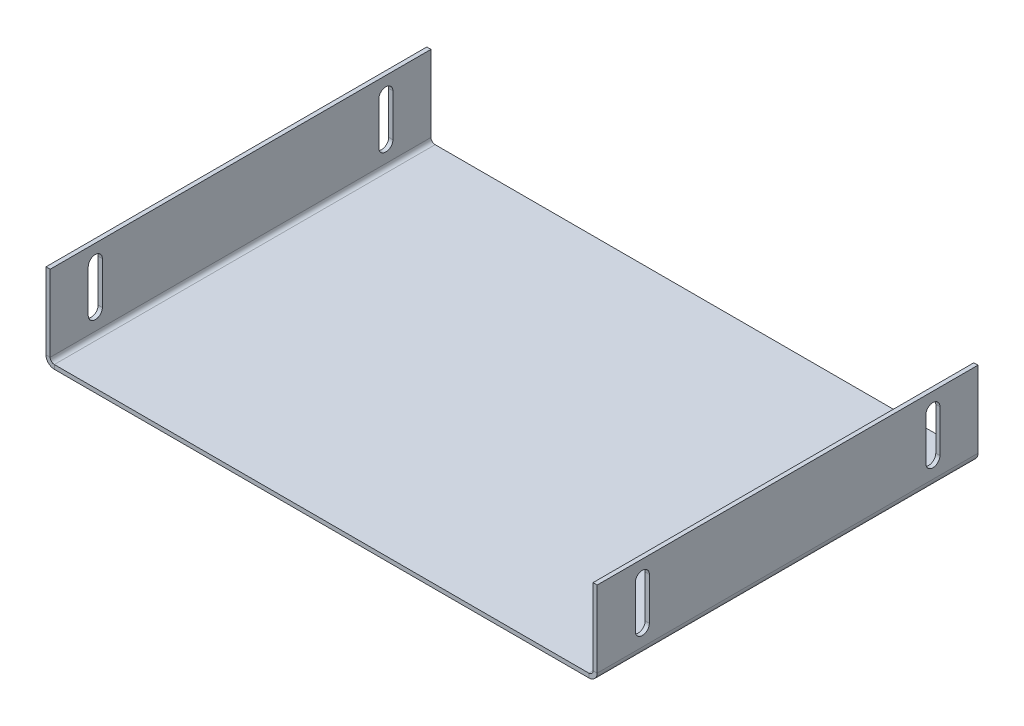
ISO-10303-21;
HEADER;
FILE_DESCRIPTION(('STEP AP214'),'2;1');
FILE_NAME('part.step','',(''),(''),'','','');
FILE_SCHEMA(('AUTOMOTIVE_DESIGN { 1 0 10303 214 1 1 1 1 }'));
ENDSEC;
DATA;
#1=APPLICATION_CONTEXT('core data for automotive mechanical design processes');
#2=APPLICATION_PROTOCOL_DEFINITION('international standard','automotive_design',2000,#1);
#3=PRODUCT_CONTEXT('',#1,'mechanical');
#4=PRODUCT('Part','Part','',(#3));
#5=PRODUCT_RELATED_PRODUCT_CATEGORY('part','',(#4));
#6=PRODUCT_DEFINITION_FORMATION('','',#4);
#7=PRODUCT_DEFINITION_CONTEXT('part definition',#1,'design');
#8=PRODUCT_DEFINITION('design','',#6,#7);
#9=PRODUCT_DEFINITION_SHAPE('','',#8);
#10=(LENGTH_UNIT() NAMED_UNIT(*) SI_UNIT(.MILLI.,.METRE.));
#11=(NAMED_UNIT(*) PLANE_ANGLE_UNIT() SI_UNIT($,.RADIAN.));
#12=(NAMED_UNIT(*) SI_UNIT($,.STERADIAN.) SOLID_ANGLE_UNIT());
#13=UNCERTAINTY_MEASURE_WITH_UNIT(LENGTH_MEASURE(1.E-05),#10,'distance_accuracy_value','');
#14=(GEOMETRIC_REPRESENTATION_CONTEXT(3) GLOBAL_UNCERTAINTY_ASSIGNED_CONTEXT((#13)) GLOBAL_UNIT_ASSIGNED_CONTEXT((#10,
#11,#12)) REPRESENTATION_CONTEXT('',''));
#15=CARTESIAN_POINT('',(0.,0.,0.));
#16=DIRECTION('',(0.,0.,1.));
#17=DIRECTION('',(1.,0.,0.));
#18=AXIS2_PLACEMENT_3D('',#15,#16,#17);
#19=CARTESIAN_POINT('',(-47.1104,-0.7366,34.7960604210801));
#20=DIRECTION('',(0.,0.,1.));
#21=DIRECTION('',(1.,0.,0.));
#22=AXIS2_PLACEMENT_3D('',#19,#20,#21);
#23=PLANE('',#22);
#24=DIRECTION('',(1.,0.,0.));
#25=VECTOR('',#24,1.);
#26=CARTESIAN_POINT('',(-47.1104,0.,34.7960604210801));
#27=LINE('',#26,#25);
#28=CARTESIAN_POINT('',(-47.3738,0.,34.7960604210801));
#29=VERTEX_POINT('',#28);
#30=CARTESIAN_POINT('',(47.3738,0.,34.7960604210801));
#31=VERTEX_POINT('',#30);
#32=EDGE_CURVE('E468',#29,#31,#27,.T.);
#33=ORIENTED_EDGE('',*,*,#32,.F.);
#34=DIRECTION('',(0.,-1.,0.));
#35=VECTOR('',#34,1.);
#36=CARTESIAN_POINT('',(-47.3738,0.,34.7960604210801));
#37=LINE('',#36,#35);
#38=CARTESIAN_POINT('',(-47.3738,-0.736600000000006,34.7960604210801));
#39=VERTEX_POINT('',#38);
#40=EDGE_CURVE('E395',#29,#39,#37,.T.);
#41=ORIENTED_EDGE('',*,*,#40,.T.);
#42=DIRECTION('',(1.,0.,0.));
#43=VECTOR('',#42,1.);
#44=CARTESIAN_POINT('',(-47.1104,-0.7366,34.7960604210801));
#45=LINE('',#44,#43);
#46=CARTESIAN_POINT('',(47.3738,-0.736599999999999,34.7960604210801));
#47=VERTEX_POINT('',#46);
#48=EDGE_CURVE('E467',#39,#47,#45,.T.);
#49=ORIENTED_EDGE('',*,*,#48,.T.);
#50=DIRECTION('',(0.,-1.,0.));
#51=VECTOR('',#50,1.);
#52=CARTESIAN_POINT('',(47.3738,0.,34.7960604210801));
#53=LINE('',#52,#51);
#54=EDGE_CURVE('E458',#31,#47,#53,.T.);
#55=ORIENTED_EDGE('',*,*,#54,.F.);
#56=EDGE_LOOP('',(#33,#41,#49,#55));
#57=FACE_BOUND('',#56,.T.);
#58=ADVANCED_FACE('F75',(#57),#23,.T.);
#59=CARTESIAN_POINT('',(-47.1104,-0.7366,-32.7039395789199));
#60=DIRECTION('',(0.,0.,-1.));
#61=DIRECTION('',(-1.,0.,0.));
#62=AXIS2_PLACEMENT_3D('',#59,#60,#61);
#63=PLANE('',#62);
#64=DIRECTION('',(-1.,0.,0.));
#65=VECTOR('',#64,1.);
#66=CARTESIAN_POINT('',(-47.1104,0.,-32.7039395789199));
#67=LINE('',#66,#65);
#68=CARTESIAN_POINT('',(47.3738,0.,-32.7039395789199));
#69=VERTEX_POINT('',#68);
#70=CARTESIAN_POINT('',(-47.3738,0.,-32.7039395789199));
#71=VERTEX_POINT('',#70);
#72=EDGE_CURVE('E461',#69,#71,#67,.T.);
#73=ORIENTED_EDGE('',*,*,#72,.F.);
#74=DIRECTION('',(0.,-1.,0.));
#75=VECTOR('',#74,1.);
#76=CARTESIAN_POINT('',(47.3738,0.,-32.7039395789199));
#77=LINE('',#76,#75);
#78=CARTESIAN_POINT('',(47.3738,-0.736599999999989,-32.7039395789199));
#79=VERTEX_POINT('',#78);
#80=EDGE_CURVE('E448',#69,#79,#77,.T.);
#81=ORIENTED_EDGE('',*,*,#80,.T.);
#82=DIRECTION('',(-1.,0.,0.));
#83=VECTOR('',#82,1.);
#84=CARTESIAN_POINT('',(-47.1104,-0.7366,-32.7039395789199));
#85=LINE('',#84,#83);
#86=CARTESIAN_POINT('',(-47.3738,-0.736599999999996,-32.7039395789199));
#87=VERTEX_POINT('',#86);
#88=EDGE_CURVE('E464',#79,#87,#85,.T.);
#89=ORIENTED_EDGE('',*,*,#88,.T.);
#90=DIRECTION('',(0.,-1.,0.));
#91=VECTOR('',#90,1.);
#92=CARTESIAN_POINT('',(-47.3738,0.,-32.7039395789199));
#93=LINE('',#92,#91);
#94=EDGE_CURVE('E405',#71,#87,#93,.T.);
#95=ORIENTED_EDGE('',*,*,#94,.F.);
#96=EDGE_LOOP('',(#73,#81,#89,#95));
#97=FACE_BOUND('',#96,.T.);
#98=ADVANCED_FACE('F77',(#97),#63,.T.);
#99=CARTESIAN_POINT('',(0.,-0.7366,0.));
#100=DIRECTION('',(0.,-1.,0.));
#101=DIRECTION('',(0.,0.,-1.));
#102=AXIS2_PLACEMENT_3D('',#99,#100,#101);
#103=PLANE('',#102);
#104=ORIENTED_EDGE('',*,*,#88,.F.);
#105=DIRECTION('',(0.,0.,-1.));
#106=VECTOR('',#105,1.);
#107=CARTESIAN_POINT('',(47.3738,-0.736599999999989,-32.7039395789199));
#108=LINE('',#107,#106);
#109=EDGE_CURVE('E441',#79,#47,#108,.F.);
#110=ORIENTED_EDGE('',*,*,#109,.T.);
#111=ORIENTED_EDGE('',*,*,#48,.F.);
#112=DIRECTION('',(0.,0.,1.));
#113=VECTOR('',#112,1.);
#114=CARTESIAN_POINT('',(-47.3738,-0.736600000000006,34.7960604210801));
#115=LINE('',#114,#113);
#116=EDGE_CURVE('E388',#39,#87,#115,.F.);
#117=ORIENTED_EDGE('',*,*,#116,.T.);
#118=EDGE_LOOP('',(#104,#110,#111,#117));
#119=FACE_BOUND('',#118,.T.);
#120=ADVANCED_FACE('F558',(#119),#103,.T.);
#121=CARTESIAN_POINT('',(0.,0.,0.));
#122=DIRECTION('',(0.,-1.,0.));
#123=DIRECTION('',(0.,0.,-1.));
#124=AXIS2_PLACEMENT_3D('',#121,#122,#123);
#125=PLANE('',#124);
#126=ORIENTED_EDGE('',*,*,#32,.T.);
#127=DIRECTION('',(0.,0.,-1.));
#128=VECTOR('',#127,1.);
#129=CARTESIAN_POINT('',(47.3738,0.,-32.7039395789199));
#130=LINE('',#129,#128);
#131=EDGE_CURVE('E454',#69,#31,#130,.F.);
#132=ORIENTED_EDGE('',*,*,#131,.F.);
#133=ORIENTED_EDGE('',*,*,#72,.T.);
#134=DIRECTION('',(0.,0.,1.));
#135=VECTOR('',#134,1.);
#136=CARTESIAN_POINT('',(-47.3738,0.,34.7960604210801));
#137=LINE('',#136,#135);
#138=EDGE_CURVE('E401',#29,#71,#137,.F.);
#139=ORIENTED_EDGE('',*,*,#138,.F.);
#140=EDGE_LOOP('',(#126,#132,#133,#139));
#141=FACE_BOUND('',#140,.T.);
#142=ADVANCED_FACE('F562',(#141),#125,.F.);
#143=CARTESIAN_POINT('',(47.3738,0.736599999999998,34.7960604210801));
#144=DIRECTION('',(0.,0.,1.));
#145=DIRECTION('',(0.,-1.,0.));
#146=AXIS2_PLACEMENT_3D('',#143,#144,#145);
#147=PLANE('',#146);
#148=DIRECTION('',(-1.,0.,0.));
#149=VECTOR('',#148,1.);
#150=CARTESIAN_POINT('',(48.847,0.736599999999994,34.7960604210801));
#151=LINE('',#150,#149);
#152=CARTESIAN_POINT('',(48.1104,0.736599999999995,34.7960604210801));
#153=VERTEX_POINT('',#152);
#154=CARTESIAN_POINT('',(48.847,0.736599999999993,34.7960604210801));
#155=VERTEX_POINT('',#154);
#156=EDGE_CURVE('E408',#153,#155,#151,.F.);
#157=ORIENTED_EDGE('',*,*,#156,.F.);
#158=CARTESIAN_POINT('',(47.3738,0.736599999999998,34.7960604210801));
#159=DIRECTION('',(0.,0.,-1.));
#160=DIRECTION('',(0.,1.,0.));
#161=AXIS2_PLACEMENT_3D('',#158,#159,#160);
#162=CIRCLE('',#161,0.736599999999997);
#163=EDGE_CURVE('E451',#31,#153,#162,.F.);
#164=ORIENTED_EDGE('',*,*,#163,.F.);
#165=ORIENTED_EDGE('',*,*,#54,.T.);
#166=CARTESIAN_POINT('',(47.3738,0.736599999999998,34.7960604210801));
#167=DIRECTION('',(0.,0.,-1.));
#168=DIRECTION('',(0.,1.,0.));
#169=AXIS2_PLACEMENT_3D('',#166,#167,#168);
#170=CIRCLE('',#169,1.4732);
#171=EDGE_CURVE('E444',#47,#155,#170,.F.);
#172=ORIENTED_EDGE('',*,*,#171,.T.);
#173=EDGE_LOOP('',(#157,#164,#165,#172));
#174=FACE_BOUND('',#173,.T.);
#175=ADVANCED_FACE('F565',(#174),#147,.T.);
#176=CARTESIAN_POINT('',(47.3738,0.736600000000008,-32.7039395789199));
#177=DIRECTION('',(0.,0.,1.));
#178=DIRECTION('',(0.,-1.,0.));
#179=AXIS2_PLACEMENT_3D('',#176,#177,#178);
#180=PLANE('',#179);
#181=CARTESIAN_POINT('',(47.3738,0.736600000000008,-32.7039395789199));
#182=DIRECTION('',(0.,0.,-1.));
#183=DIRECTION('',(0.,1.,0.));
#184=AXIS2_PLACEMENT_3D('',#181,#182,#183);
#185=CIRCLE('',#184,0.736599999999997);
#186=CARTESIAN_POINT('',(48.1104,0.736600000000005,-32.7039395789199));
#187=VERTEX_POINT('',#186);
#188=EDGE_CURVE('E414',#187,#69,#185,.T.);
#189=ORIENTED_EDGE('',*,*,#188,.F.);
#190=DIRECTION('',(-1.,0.,0.));
#191=VECTOR('',#190,1.);
#192=CARTESIAN_POINT('',(48.1104,0.736600000000004,-32.7039395789199));
#193=LINE('',#192,#191);
#194=CARTESIAN_POINT('',(48.847,0.736600000000001,-32.7039395789199));
#195=VERTEX_POINT('',#194);
#196=EDGE_CURVE('E434',#187,#195,#193,.F.);
#197=ORIENTED_EDGE('',*,*,#196,.T.);
#198=CARTESIAN_POINT('',(47.3738,0.736600000000008,-32.7039395789199));
#199=DIRECTION('',(0.,0.,-1.));
#200=DIRECTION('',(0.,1.,0.));
#201=AXIS2_PLACEMENT_3D('',#198,#199,#200);
#202=CIRCLE('',#201,1.4732);
#203=EDGE_CURVE('E445',#195,#79,#202,.T.);
#204=ORIENTED_EDGE('',*,*,#203,.T.);
#205=ORIENTED_EDGE('',*,*,#80,.F.);
#206=EDGE_LOOP('',(#189,#197,#204,#205));
#207=FACE_BOUND('',#206,.T.);
#208=ADVANCED_FACE('F570',(#207),#180,.F.);
#209=CARTESIAN_POINT('',(47.3738,0.736600000000008,-32.7039395789199));
#210=DIRECTION('',(0.,0.,-1.));
#211=DIRECTION('',(1.,0.,0.));
#212=AXIS2_PLACEMENT_3D('',#209,#210,#211);
#213=CYLINDRICAL_SURFACE('',#212,1.4732);
#214=ORIENTED_EDGE('',*,*,#109,.F.);
#215=ORIENTED_EDGE('',*,*,#203,.F.);
#216=DIRECTION('',(0.,0.,-1.));
#217=VECTOR('',#216,1.);
#218=CARTESIAN_POINT('',(48.847,0.736599999999994,34.79606042108));
#219=LINE('',#218,#217);
#220=EDGE_CURVE('E432',#195,#155,#219,.F.);
#221=ORIENTED_EDGE('',*,*,#220,.T.);
#222=ORIENTED_EDGE('',*,*,#171,.F.);
#223=EDGE_LOOP('',(#214,#215,#221,#222));
#224=FACE_BOUND('',#223,.T.);
#225=ADVANCED_FACE('F573',(#224),#213,.T.);
#226=CARTESIAN_POINT('',(47.3738,0.736600000000008,-32.7039395789199));
#227=DIRECTION('',(0.,0.,-1.));
#228=DIRECTION('',(1.,0.,0.));
#229=AXIS2_PLACEMENT_3D('',#226,#227,#228);
#230=CYLINDRICAL_SURFACE('',#229,0.736599999999997);
#231=ORIENTED_EDGE('',*,*,#131,.T.);
#232=ORIENTED_EDGE('',*,*,#163,.T.);
#233=DIRECTION('',(0.,0.,-1.));
#234=VECTOR('',#233,1.);
#235=CARTESIAN_POINT('',(48.1104,0.736599999999997,34.79606042108));
#236=LINE('',#235,#234);
#237=EDGE_CURVE('E437',#153,#187,#236,.T.);
#238=ORIENTED_EDGE('',*,*,#237,.T.);
#239=ORIENTED_EDGE('',*,*,#188,.T.);
#240=EDGE_LOOP('',(#231,#232,#238,#239));
#241=FACE_BOUND('',#240,.T.);
#242=ADVANCED_FACE('F578',(#241),#230,.F.);
#243=CARTESIAN_POINT('',(48.847,0.,34.7960604210801));
#244=DIRECTION('',(0.,0.,-1.));
#245=DIRECTION('',(0.,1.,0.));
#246=AXIS2_PLACEMENT_3D('',#243,#244,#245);
#247=PLANE('',#246);
#248=ORIENTED_EDGE('',*,*,#156,.T.);
#249=DIRECTION('',(0.,-1.,0.));
#250=VECTOR('',#249,1.);
#251=CARTESIAN_POINT('',(48.847,3.10974337149926E-13,34.7960604210801));
#252=LINE('',#251,#250);
#253=CARTESIAN_POINT('',(48.8470000000001,14.2634,34.7960604210799));
#254=VERTEX_POINT('',#253);
#255=EDGE_CURVE('E422',#254,#155,#252,.T.);
#256=ORIENTED_EDGE('',*,*,#255,.F.);
#257=DIRECTION('',(-1.,0.,0.));
#258=VECTOR('',#257,1.);
#259=CARTESIAN_POINT('',(48.8470000000001,14.2634,34.7960604210799));
#260=LINE('',#259,#258);
#261=CARTESIAN_POINT('',(48.1104000000001,14.2634,34.7960604210799));
#262=VERTEX_POINT('',#261);
#263=EDGE_CURVE('E415',#254,#262,#260,.T.);
#264=ORIENTED_EDGE('',*,*,#263,.T.);
#265=DIRECTION('',(0.,1.,0.));
#266=VECTOR('',#265,1.);
#267=CARTESIAN_POINT('',(48.1104,0.,34.7960604210801));
#268=LINE('',#267,#266);
#269=EDGE_CURVE('E429',#262,#153,#268,.F.);
#270=ORIENTED_EDGE('',*,*,#269,.T.);
#271=EDGE_LOOP('',(#248,#256,#264,#270));
#272=FACE_BOUND('',#271,.T.);
#273=ADVANCED_FACE('F581',(#272),#247,.F.);
#274=CARTESIAN_POINT('',(48.8470000000001,14.2634,-32.7039395789201));
#275=DIRECTION('',(0.,0.,1.));
#276=DIRECTION('',(0.,-1.,0.));
#277=AXIS2_PLACEMENT_3D('',#274,#275,#276);
#278=PLANE('',#277);
#279=ORIENTED_EDGE('',*,*,#196,.F.);
#280=DIRECTION('',(0.,-1.,0.));
#281=VECTOR('',#280,1.);
#282=CARTESIAN_POINT('',(48.1104000000001,14.2634,-32.7039395789201));
#283=LINE('',#282,#281);
#284=CARTESIAN_POINT('',(48.1104000000001,14.2634,-32.7039395789201));
#285=VERTEX_POINT('',#284);
#286=EDGE_CURVE('E427',#187,#285,#283,.F.);
#287=ORIENTED_EDGE('',*,*,#286,.T.);
#288=DIRECTION('',(-1.,0.,0.));
#289=VECTOR('',#288,1.);
#290=CARTESIAN_POINT('',(48.8470000000001,14.2634,-32.7039395789201));
#291=LINE('',#290,#289);
#292=CARTESIAN_POINT('',(48.8470000000001,14.2634,-32.7039395789201));
#293=VERTEX_POINT('',#292);
#294=EDGE_CURVE('E411',#293,#285,#291,.T.);
#295=ORIENTED_EDGE('',*,*,#294,.F.);
#296=DIRECTION('',(0.,1.,0.));
#297=VECTOR('',#296,1.);
#298=CARTESIAN_POINT('',(48.847,-6.24387403063669E-13,-32.7039395789199));
#299=LINE('',#298,#297);
#300=EDGE_CURVE('E420',#195,#293,#299,.T.);
#301=ORIENTED_EDGE('',*,*,#300,.F.);
#302=EDGE_LOOP('',(#279,#287,#295,#301));
#303=FACE_BOUND('',#302,.T.);
#304=ADVANCED_FACE('F588',(#303),#278,.F.);
#305=CARTESIAN_POINT('',(48.847,-1.63000507768044E-13,0.));
#306=DIRECTION('',(-1.,0.,0.));
#307=DIRECTION('',(0.,-1.,0.));
#308=AXIS2_PLACEMENT_3D('',#305,#306,#307);
#309=PLANE('',#308);
#310=DIRECTION('',(0.,1.,0.));
#311=VECTOR('',#310,1.);
#312=CARTESIAN_POINT('',(48.8470000000001,11.2634000000003,-23.4539395789201));
#313=LINE('',#312,#311);
#314=CARTESIAN_POINT('',(48.8470000000001,3.76340000000029,-23.4539395789201));
#315=VERTEX_POINT('',#314);
#316=CARTESIAN_POINT('',(48.8470000000001,11.2634000000003,-23.4539395789201));
#317=VERTEX_POINT('',#316);
#318=EDGE_CURVE('E279',#315,#317,#313,.T.);
#319=ORIENTED_EDGE('',*,*,#318,.T.);
#320=CARTESIAN_POINT('',(48.8470000000001,11.2634000000003,-24.7039395789201));
#321=DIRECTION('',(-1.,0.,0.));
#322=DIRECTION('',(0.,-1.,0.));
#323=AXIS2_PLACEMENT_3D('',#320,#321,#322);
#324=CIRCLE('',#323,1.25);
#325=CARTESIAN_POINT('',(48.8470000000001,11.2634000000003,-25.9539395789201));
#326=VERTEX_POINT('',#325);
#327=EDGE_CURVE('E262',#317,#326,#324,.T.);
#328=ORIENTED_EDGE('',*,*,#327,.T.);
#329=DIRECTION('',(0.,-1.,0.));
#330=VECTOR('',#329,1.);
#331=CARTESIAN_POINT('',(48.8470000000001,11.2634000000003,-25.9539395789201));
#332=LINE('',#331,#330);
#333=CARTESIAN_POINT('',(48.847,3.76339999999996,-25.9539395789201));
#334=VERTEX_POINT('',#333);
#335=EDGE_CURVE('E271',#326,#334,#332,.T.);
#336=ORIENTED_EDGE('',*,*,#335,.T.);
#337=CARTESIAN_POINT('',(48.8470000000001,3.76340000000029,-24.7039395789201));
#338=DIRECTION('',(-1.,0.,0.));
#339=DIRECTION('',(0.,-1.,0.));
#340=AXIS2_PLACEMENT_3D('',#337,#338,#339);
#341=CIRCLE('',#340,1.25);
#342=EDGE_CURVE('E90',#334,#315,#341,.T.);
#343=ORIENTED_EDGE('',*,*,#342,.T.);
#344=EDGE_LOOP('',(#319,#328,#336,#343));
#345=FACE_BOUND('',#344,.T.);
#346=DIRECTION('',(0.,1.,0.));
#347=VECTOR('',#346,1.);
#348=CARTESIAN_POINT('',(48.8470000000001,11.2634000000003,28.0460604210799));
#349=LINE('',#348,#347);
#350=CARTESIAN_POINT('',(48.8470000000001,3.76340000000029,28.0460604210799));
#351=VERTEX_POINT('',#350);
#352=CARTESIAN_POINT('',(48.8470000000001,11.2634000000003,28.0460604210799));
#353=VERTEX_POINT('',#352);
#354=EDGE_CURVE('E321',#351,#353,#349,.T.);
#355=ORIENTED_EDGE('',*,*,#354,.T.);
#356=CARTESIAN_POINT('',(48.8470000000001,11.2634000000003,26.7960604210799));
#357=DIRECTION('',(-1.,0.,0.));
#358=DIRECTION('',(0.,-1.,0.));
#359=AXIS2_PLACEMENT_3D('',#356,#357,#358);
#360=CIRCLE('',#359,1.25);
#361=CARTESIAN_POINT('',(48.8470000000001,11.2634000000003,25.5460604210799));
#362=VERTEX_POINT('',#361);
#363=EDGE_CURVE('E311',#353,#362,#360,.T.);
#364=ORIENTED_EDGE('',*,*,#363,.T.);
#365=DIRECTION('',(0.,-1.,0.));
#366=VECTOR('',#365,1.);
#367=CARTESIAN_POINT('',(48.8470000000001,11.2634000000003,25.5460604210799));
#368=LINE('',#367,#366);
#369=CARTESIAN_POINT('',(48.847,3.76339999999996,25.5460604210799));
#370=VERTEX_POINT('',#369);
#371=EDGE_CURVE('E314',#362,#370,#368,.T.);
#372=ORIENTED_EDGE('',*,*,#371,.T.);
#373=CARTESIAN_POINT('',(48.8470000000001,3.76340000000029,26.7960604210799));
#374=DIRECTION('',(-1.,0.,0.));
#375=DIRECTION('',(0.,-1.,0.));
#376=AXIS2_PLACEMENT_3D('',#373,#374,#375);
#377=CIRCLE('',#376,1.25);
#378=EDGE_CURVE('E318',#370,#351,#377,.T.);
#379=ORIENTED_EDGE('',*,*,#378,.T.);
#380=EDGE_LOOP('',(#355,#364,#372,#379));
#381=FACE_BOUND('',#380,.T.);
#382=ORIENTED_EDGE('',*,*,#220,.F.);
#383=ORIENTED_EDGE('',*,*,#300,.T.);
#384=DIRECTION('',(0.,0.,1.));
#385=VECTOR('',#384,1.);
#386=CARTESIAN_POINT('',(48.8470000000001,14.2634,0.));
#387=LINE('',#386,#385);
#388=EDGE_CURVE('E418',#293,#254,#387,.T.);
#389=ORIENTED_EDGE('',*,*,#388,.T.);
#390=ORIENTED_EDGE('',*,*,#255,.T.);
#391=EDGE_LOOP('',(#382,#383,#389,#390));
#392=FACE_BOUND('',#391,.T.);
#393=ADVANCED_FACE('F276',(#345,#381,#392),#309,.F.);
#394=CARTESIAN_POINT('',(48.1104,-1.60428682613852E-13,0.));
#395=DIRECTION('',(-1.,0.,0.));
#396=DIRECTION('',(0.,-1.,0.));
#397=AXIS2_PLACEMENT_3D('',#394,#395,#396);
#398=PLANE('',#397);
#399=CARTESIAN_POINT('',(48.1104000000001,11.2634000000003,-24.7039395789201));
#400=DIRECTION('',(-1.,0.,0.));
#401=DIRECTION('',(0.,-1.,0.));
#402=AXIS2_PLACEMENT_3D('',#399,#400,#401);
#403=CIRCLE('',#402,1.25);
#404=CARTESIAN_POINT('',(48.1104,11.2634000000003,-23.4539395789201));
#405=VERTEX_POINT('',#404);
#406=CARTESIAN_POINT('',(48.1104000000001,11.2634000000003,-25.9539395789201));
#407=VERTEX_POINT('',#406);
#408=EDGE_CURVE('E265',#405,#407,#403,.T.);
#409=ORIENTED_EDGE('',*,*,#408,.F.);
#410=DIRECTION('',(0.,1.,0.));
#411=VECTOR('',#410,1.);
#412=CARTESIAN_POINT('',(48.1104,-1.71278309171637E-13,-23.4539395789201));
#413=LINE('',#412,#411);
#414=CARTESIAN_POINT('',(48.1104,3.76340000000029,-23.4539395789201));
#415=VERTEX_POINT('',#414);
#416=EDGE_CURVE('E307',#415,#405,#413,.T.);
#417=ORIENTED_EDGE('',*,*,#416,.F.);
#418=CARTESIAN_POINT('',(48.1104,3.76340000000029,-24.7039395789201));
#419=DIRECTION('',(-1.,0.,0.));
#420=DIRECTION('',(0.,-1.,0.));
#421=AXIS2_PLACEMENT_3D('',#418,#419,#420);
#422=CIRCLE('',#421,1.25);
#423=CARTESIAN_POINT('',(48.1104,3.76340000000029,-25.9539395789201));
#424=VERTEX_POINT('',#423);
#425=EDGE_CURVE('E305',#424,#415,#422,.T.);
#426=ORIENTED_EDGE('',*,*,#425,.F.);
#427=DIRECTION('',(0.,-1.,0.));
#428=VECTOR('',#427,1.);
#429=CARTESIAN_POINT('',(48.1104,-1.72434791488955E-13,-25.9539395789201));
#430=LINE('',#429,#428);
#431=EDGE_CURVE('E297',#407,#424,#430,.T.);
#432=ORIENTED_EDGE('',*,*,#431,.F.);
#433=EDGE_LOOP('',(#409,#417,#426,#432));
#434=FACE_BOUND('',#433,.T.);
#435=CARTESIAN_POINT('',(48.1104000000001,11.2634000000003,26.7960604210799));
#436=DIRECTION('',(-1.,0.,0.));
#437=DIRECTION('',(0.,-1.,0.));
#438=AXIS2_PLACEMENT_3D('',#435,#436,#437);
#439=CIRCLE('',#438,1.25);
#440=CARTESIAN_POINT('',(48.1104,11.2634000000003,28.0460604210799));
#441=VERTEX_POINT('',#440);
#442=CARTESIAN_POINT('',(48.1104000000001,11.2634000000003,25.5460604210799));
#443=VERTEX_POINT('',#442);
#444=EDGE_CURVE('E354',#441,#443,#439,.T.);
#445=ORIENTED_EDGE('',*,*,#444,.F.);
#446=DIRECTION('',(0.,1.,0.));
#447=VECTOR('',#446,1.);
#448=CARTESIAN_POINT('',(48.1104,-1.60428682613852E-13,28.0460604210799));
#449=LINE('',#448,#447);
#450=CARTESIAN_POINT('',(48.1104,3.76340000000029,28.0460604210799));
#451=VERTEX_POINT('',#450);
#452=EDGE_CURVE('E352',#451,#441,#449,.T.);
#453=ORIENTED_EDGE('',*,*,#452,.F.);
#454=CARTESIAN_POINT('',(48.1104,3.76340000000029,26.7960604210799));
#455=DIRECTION('',(-1.,0.,0.));
#456=DIRECTION('',(0.,-1.,0.));
#457=AXIS2_PLACEMENT_3D('',#454,#455,#456);
#458=CIRCLE('',#457,1.25);
#459=CARTESIAN_POINT('',(48.1104,3.76340000000029,25.5460604210799));
#460=VERTEX_POINT('',#459);
#461=EDGE_CURVE('E350',#460,#451,#458,.T.);
#462=ORIENTED_EDGE('',*,*,#461,.F.);
#463=DIRECTION('',(0.,-1.,0.));
#464=VECTOR('',#463,1.);
#465=CARTESIAN_POINT('',(48.1104,-1.60428682613852E-13,25.5460604210799));
#466=LINE('',#465,#464);
#467=EDGE_CURVE('E337',#443,#460,#466,.T.);
#468=ORIENTED_EDGE('',*,*,#467,.F.);
#469=EDGE_LOOP('',(#445,#453,#462,#468));
#470=FACE_BOUND('',#469,.T.);
#471=ORIENTED_EDGE('',*,*,#286,.F.);
#472=ORIENTED_EDGE('',*,*,#237,.F.);
#473=ORIENTED_EDGE('',*,*,#269,.F.);
#474=DIRECTION('',(0.,0.,-1.));
#475=VECTOR('',#474,1.);
#476=CARTESIAN_POINT('',(48.1104000000001,14.2634,34.7960604210799));
#477=LINE('',#476,#475);
#478=EDGE_CURVE('E425',#285,#262,#477,.F.);
#479=ORIENTED_EDGE('',*,*,#478,.F.);
#480=EDGE_LOOP('',(#471,#472,#473,#479));
#481=FACE_BOUND('',#480,.T.);
#482=ADVANCED_FACE('F596',(#434,#470,#481),#398,.T.);
#483=CARTESIAN_POINT('',(48.8470000000001,14.2634,34.7960604210799));
#484=DIRECTION('',(0.,-1.,0.));
#485=DIRECTION('',(1.,0.,0.));
#486=AXIS2_PLACEMENT_3D('',#483,#484,#485);
#487=PLANE('',#486);
#488=ORIENTED_EDGE('',*,*,#478,.T.);
#489=ORIENTED_EDGE('',*,*,#263,.F.);
#490=ORIENTED_EDGE('',*,*,#388,.F.);
#491=ORIENTED_EDGE('',*,*,#294,.T.);
#492=EDGE_LOOP('',(#488,#489,#490,#491));
#493=FACE_BOUND('',#492,.T.);
#494=ADVANCED_FACE('F593',(#493),#487,.F.);
#495=CARTESIAN_POINT('',(-47.3738,0.736600000000001,-32.7039395789199));
#496=DIRECTION('',(0.,0.,-1.));
#497=DIRECTION('',(0.,1.,0.));
#498=AXIS2_PLACEMENT_3D('',#495,#496,#497);
#499=PLANE('',#498);
#500=DIRECTION('',(1.,0.,0.));
#501=VECTOR('',#500,1.);
#502=CARTESIAN_POINT('',(-48.847,0.736599999999994,-32.7039395789199));
#503=LINE('',#502,#501);
#504=CARTESIAN_POINT('',(-48.1104,0.736599999999998,-32.7039395789199));
#505=VERTEX_POINT('',#504);
#506=CARTESIAN_POINT('',(-48.847,0.736599999999996,-32.7039395789199));
#507=VERTEX_POINT('',#506);
#508=EDGE_CURVE('E357',#505,#507,#503,.F.);
#509=ORIENTED_EDGE('',*,*,#508,.F.);
#510=CARTESIAN_POINT('',(-47.3738,0.736600000000001,-32.7039395789199));
#511=DIRECTION('',(0.,0.,1.));
#512=DIRECTION('',(0.,-1.,0.));
#513=AXIS2_PLACEMENT_3D('',#510,#511,#512);
#514=CIRCLE('',#513,0.736599999999997);
#515=EDGE_CURVE('E398',#71,#505,#514,.F.);
#516=ORIENTED_EDGE('',*,*,#515,.F.);
#517=ORIENTED_EDGE('',*,*,#94,.T.);
#518=CARTESIAN_POINT('',(-47.3738,0.736600000000001,-32.7039395789199));
#519=DIRECTION('',(0.,0.,1.));
#520=DIRECTION('',(0.,-1.,0.));
#521=AXIS2_PLACEMENT_3D('',#518,#519,#520);
#522=CIRCLE('',#521,1.4732);
#523=EDGE_CURVE('E391',#87,#507,#522,.F.);
#524=ORIENTED_EDGE('',*,*,#523,.T.);
#525=EDGE_LOOP('',(#509,#516,#517,#524));
#526=FACE_BOUND('',#525,.T.);
#527=ADVANCED_FACE('F539',(#526),#499,.T.);
#528=CARTESIAN_POINT('',(-47.3738,0.736599999999991,34.7960604210801));
#529=DIRECTION('',(0.,0.,-1.));
#530=DIRECTION('',(0.,1.,0.));
#531=AXIS2_PLACEMENT_3D('',#528,#529,#530);
#532=PLANE('',#531);
#533=CARTESIAN_POINT('',(-47.3738,0.736599999999991,34.7960604210801));
#534=DIRECTION('',(0.,0.,1.));
#535=DIRECTION('',(0.,-1.,0.));
#536=AXIS2_PLACEMENT_3D('',#533,#534,#535);
#537=CIRCLE('',#536,0.736599999999997);
#538=CARTESIAN_POINT('',(-48.1104,0.736599999999988,34.7960604210801));
#539=VERTEX_POINT('',#538);
#540=EDGE_CURVE('E361',#539,#29,#537,.T.);
#541=ORIENTED_EDGE('',*,*,#540,.F.);
#542=DIRECTION('',(1.,0.,0.));
#543=VECTOR('',#542,1.);
#544=CARTESIAN_POINT('',(-48.1104,0.73659999999999,34.7960604210801));
#545=LINE('',#544,#543);
#546=CARTESIAN_POINT('',(-48.847,0.736599999999988,34.7960604210801));
#547=VERTEX_POINT('',#546);
#548=EDGE_CURVE('E381',#539,#547,#545,.F.);
#549=ORIENTED_EDGE('',*,*,#548,.T.);
#550=CARTESIAN_POINT('',(-47.3738,0.736599999999991,34.7960604210801));
#551=DIRECTION('',(0.,0.,1.));
#552=DIRECTION('',(0.,-1.,0.));
#553=AXIS2_PLACEMENT_3D('',#550,#551,#552);
#554=CIRCLE('',#553,1.4732);
#555=EDGE_CURVE('E392',#547,#39,#554,.T.);
#556=ORIENTED_EDGE('',*,*,#555,.T.);
#557=ORIENTED_EDGE('',*,*,#40,.F.);
#558=EDGE_LOOP('',(#541,#549,#556,#557));
#559=FACE_BOUND('',#558,.T.);
#560=ADVANCED_FACE('F603',(#559),#532,.F.);
#561=CARTESIAN_POINT('',(-47.3738,0.736599999999991,34.7960604210801));
#562=DIRECTION('',(0.,0.,1.));
#563=DIRECTION('',(-1.,0.,0.));
#564=AXIS2_PLACEMENT_3D('',#561,#562,#563);
#565=CYLINDRICAL_SURFACE('',#564,1.4732);
#566=ORIENTED_EDGE('',*,*,#116,.F.);
#567=ORIENTED_EDGE('',*,*,#555,.F.);
#568=DIRECTION('',(0.,0.,1.));
#569=VECTOR('',#568,1.);
#570=CARTESIAN_POINT('',(-48.847,0.736599999999994,-32.70393957892));
#571=LINE('',#570,#569);
#572=EDGE_CURVE('E379',#547,#507,#571,.F.);
#573=ORIENTED_EDGE('',*,*,#572,.T.);
#574=ORIENTED_EDGE('',*,*,#523,.F.);
#575=EDGE_LOOP('',(#566,#567,#573,#574));
#576=FACE_BOUND('',#575,.T.);
#577=ADVANCED_FACE('F606',(#576),#565,.T.);
#578=CARTESIAN_POINT('',(-47.3738,0.736599999999991,34.7960604210801));
#579=DIRECTION('',(0.,0.,1.));
#580=DIRECTION('',(-1.,0.,0.));
#581=AXIS2_PLACEMENT_3D('',#578,#579,#580);
#582=CYLINDRICAL_SURFACE('',#581,0.736599999999997);
#583=ORIENTED_EDGE('',*,*,#138,.T.);
#584=ORIENTED_EDGE('',*,*,#515,.T.);
#585=DIRECTION('',(0.,0.,1.));
#586=VECTOR('',#585,1.);
#587=CARTESIAN_POINT('',(-48.1104,0.736599999999997,-32.70393957892));
#588=LINE('',#587,#586);
#589=EDGE_CURVE('E384',#505,#539,#588,.T.);
#590=ORIENTED_EDGE('',*,*,#589,.T.);
#591=ORIENTED_EDGE('',*,*,#540,.T.);
#592=EDGE_LOOP('',(#583,#584,#590,#591));
#593=FACE_BOUND('',#592,.T.);
#594=ADVANCED_FACE('F542',(#593),#582,.F.);
#595=CARTESIAN_POINT('',(-48.847,0.,-32.7039395789199));
#596=DIRECTION('',(0.,0.,1.));
#597=DIRECTION('',(0.,-1.,0.));
#598=AXIS2_PLACEMENT_3D('',#595,#596,#597);
#599=PLANE('',#598);
#600=ORIENTED_EDGE('',*,*,#508,.T.);
#601=DIRECTION('',(0.,-1.,0.));
#602=VECTOR('',#601,1.);
#603=CARTESIAN_POINT('',(-48.847,-6.0847751012244E-13,-32.7039395789199));
#604=LINE('',#603,#602);
#605=CARTESIAN_POINT('',(-48.8470000000001,14.2634,-32.7039395789201));
#606=VERTEX_POINT('',#605);
#607=EDGE_CURVE('E369',#606,#507,#604,.T.);
#608=ORIENTED_EDGE('',*,*,#607,.F.);
#609=DIRECTION('',(1.,0.,0.));
#610=VECTOR('',#609,1.);
#611=CARTESIAN_POINT('',(-48.8470000000001,14.2634,-32.7039395789201));
#612=LINE('',#611,#610);
#613=CARTESIAN_POINT('',(-48.1104000000001,14.2634,-32.7039395789201));
#614=VERTEX_POINT('',#613);
#615=EDGE_CURVE('E362',#606,#614,#612,.T.);
#616=ORIENTED_EDGE('',*,*,#615,.T.);
#617=DIRECTION('',(0.,1.,0.));
#618=VECTOR('',#617,1.);
#619=CARTESIAN_POINT('',(-48.1104,0.,-32.7039395789199));
#620=LINE('',#619,#618);
#621=EDGE_CURVE('E376',#614,#505,#620,.F.);
#622=ORIENTED_EDGE('',*,*,#621,.T.);
#623=EDGE_LOOP('',(#600,#608,#616,#622));
#624=FACE_BOUND('',#623,.T.);
#625=ADVANCED_FACE('F536',(#624),#599,.F.);
#626=CARTESIAN_POINT('',(-48.8470000000001,14.2634,34.7960604210799));
#627=DIRECTION('',(0.,0.,-1.));
#628=DIRECTION('',(0.,1.,0.));
#629=AXIS2_PLACEMENT_3D('',#626,#627,#628);
#630=PLANE('',#629);
#631=ORIENTED_EDGE('',*,*,#548,.F.);
#632=DIRECTION('',(0.,-1.,0.));
#633=VECTOR('',#632,1.);
#634=CARTESIAN_POINT('',(-48.1104000000001,14.2634,34.7960604210799));
#635=LINE('',#634,#633);
#636=CARTESIAN_POINT('',(-48.1104000000001,14.2634,34.7960604210799));
#637=VERTEX_POINT('',#636);
#638=EDGE_CURVE('E374',#539,#637,#635,.F.);
#639=ORIENTED_EDGE('',*,*,#638,.T.);
#640=DIRECTION('',(1.,0.,0.));
#641=VECTOR('',#640,1.);
#642=CARTESIAN_POINT('',(-48.8470000000001,14.2634,34.7960604210799));
#643=LINE('',#642,#641);
#644=CARTESIAN_POINT('',(-48.8470000000001,14.2634,34.7960604210799));
#645=VERTEX_POINT('',#644);
#646=EDGE_CURVE('E358',#645,#637,#643,.T.);
#647=ORIENTED_EDGE('',*,*,#646,.F.);
#648=DIRECTION('',(0.,1.,0.));
#649=VECTOR('',#648,1.);
#650=CARTESIAN_POINT('',(-48.847,3.10974337149926E-13,34.7960604210801));
#651=LINE('',#650,#649);
#652=EDGE_CURVE('E367',#547,#645,#651,.T.);
#653=ORIENTED_EDGE('',*,*,#652,.F.);
#654=EDGE_LOOP('',(#631,#639,#647,#653));
#655=FACE_BOUND('',#654,.T.);
#656=ADVANCED_FACE('F515',(#655),#630,.F.);
#657=CARTESIAN_POINT('',(-48.847,-1.63000507768044E-13,0.));
#658=DIRECTION('',(1.,0.,0.));
#659=DIRECTION('',(0.,1.,0.));
#660=AXIS2_PLACEMENT_3D('',#657,#658,#659);
#661=PLANE('',#660);
#662=DIRECTION('',(0.,-1.,0.));
#663=VECTOR('',#662,1.);
#664=CARTESIAN_POINT('',(-48.8470000000001,11.2634,-25.9539395789201));
#665=LINE('',#664,#663);
#666=CARTESIAN_POINT('',(-48.8470000000001,11.2634000000003,-25.9539395789201));
#667=VERTEX_POINT('',#666);
#668=CARTESIAN_POINT('',(-48.847,3.76339999999996,-25.9539395789201));
#669=VERTEX_POINT('',#668);
#670=EDGE_CURVE('E290',#667,#669,#665,.T.);
#671=ORIENTED_EDGE('',*,*,#670,.F.);
#672=CARTESIAN_POINT('',(-48.8470000000001,11.2634,-24.7039395789201));
#673=DIRECTION('',(-1.,0.,0.));
#674=DIRECTION('',(0.,-1.,0.));
#675=AXIS2_PLACEMENT_3D('',#672,#673,#674);
#676=CIRCLE('',#675,1.25);
#677=CARTESIAN_POINT('',(-48.8470000000001,11.2634,-23.4539395789201));
#678=VERTEX_POINT('',#677);
#679=EDGE_CURVE('E288',#678,#667,#676,.T.);
#680=ORIENTED_EDGE('',*,*,#679,.F.);
#681=DIRECTION('',(0.,1.,0.));
#682=VECTOR('',#681,1.);
#683=CARTESIAN_POINT('',(-48.8470000000001,11.2634,-23.4539395789201));
#684=LINE('',#683,#682);
#685=CARTESIAN_POINT('',(-48.847,3.76339999999996,-23.4539395789201));
#686=VERTEX_POINT('',#685);
#687=EDGE_CURVE('E280',#686,#678,#684,.T.);
#688=ORIENTED_EDGE('',*,*,#687,.F.);
#689=CARTESIAN_POINT('',(-48.847,3.76339999999996,-24.7039395789201));
#690=DIRECTION('',(-1.,0.,0.));
#691=DIRECTION('',(0.,-1.,0.));
#692=AXIS2_PLACEMENT_3D('',#689,#690,#691);
#693=CIRCLE('',#692,1.25);
#694=EDGE_CURVE('E283',#669,#686,#693,.T.);
#695=ORIENTED_EDGE('',*,*,#694,.F.);
#696=EDGE_LOOP('',(#671,#680,#688,#695));
#697=FACE_BOUND('',#696,.T.);
#698=DIRECTION('',(0.,-1.,0.));
#699=VECTOR('',#698,1.);
#700=CARTESIAN_POINT('',(-48.8470000000001,11.2634,25.5460604210799));
#701=LINE('',#700,#699);
#702=CARTESIAN_POINT('',(-48.8470000000001,11.2634000000003,25.5460604210799));
#703=VERTEX_POINT('',#702);
#704=CARTESIAN_POINT('',(-48.847,3.76339999999996,25.5460604210799));
#705=VERTEX_POINT('',#704);
#706=EDGE_CURVE('E326',#703,#705,#701,.T.);
#707=ORIENTED_EDGE('',*,*,#706,.F.);
#708=CARTESIAN_POINT('',(-48.8470000000001,11.2634,26.7960604210799));
#709=DIRECTION('',(-1.,0.,0.));
#710=DIRECTION('',(0.,-1.,0.));
#711=AXIS2_PLACEMENT_3D('',#708,#709,#710);
#712=CIRCLE('',#711,1.25);
#713=CARTESIAN_POINT('',(-48.8470000000001,11.2634,28.0460604210799));
#714=VERTEX_POINT('',#713);
#715=EDGE_CURVE('E310',#714,#703,#712,.T.);
#716=ORIENTED_EDGE('',*,*,#715,.F.);
#717=DIRECTION('',(0.,1.,0.));
#718=VECTOR('',#717,1.);
#719=CARTESIAN_POINT('',(-48.8470000000001,11.2634,28.0460604210799));
#720=LINE('',#719,#718);
#721=CARTESIAN_POINT('',(-48.847,3.76339999999996,28.0460604210799));
#722=VERTEX_POINT('',#721);
#723=EDGE_CURVE('E315',#722,#714,#720,.T.);
#724=ORIENTED_EDGE('',*,*,#723,.F.);
#725=CARTESIAN_POINT('',(-48.847,3.76339999999996,26.7960604210799));
#726=DIRECTION('',(-1.,0.,0.));
#727=DIRECTION('',(0.,-1.,0.));
#728=AXIS2_PLACEMENT_3D('',#725,#726,#727);
#729=CIRCLE('',#728,1.25);
#730=EDGE_CURVE('E329',#705,#722,#729,.T.);
#731=ORIENTED_EDGE('',*,*,#730,.F.);
#732=EDGE_LOOP('',(#707,#716,#724,#731));
#733=FACE_BOUND('',#732,.T.);
#734=ORIENTED_EDGE('',*,*,#572,.F.);
#735=ORIENTED_EDGE('',*,*,#652,.T.);
#736=DIRECTION('',(0.,0.,-1.));
#737=VECTOR('',#736,1.);
#738=CARTESIAN_POINT('',(-48.8470000000001,14.2634,0.));
#739=LINE('',#738,#737);
#740=EDGE_CURVE('E365',#645,#606,#739,.T.);
#741=ORIENTED_EDGE('',*,*,#740,.T.);
#742=ORIENTED_EDGE('',*,*,#607,.T.);
#743=EDGE_LOOP('',(#734,#735,#741,#742));
#744=FACE_BOUND('',#743,.T.);
#745=ADVANCED_FACE('F512',(#697,#733,#744),#661,.F.);
#746=CARTESIAN_POINT('',(-48.1104,-1.60428682613852E-13,0.));
#747=DIRECTION('',(1.,0.,0.));
#748=DIRECTION('',(0.,1.,0.));
#749=AXIS2_PLACEMENT_3D('',#746,#747,#748);
#750=PLANE('',#749);
#751=CARTESIAN_POINT('',(-48.1104,11.2634,-24.7039395789201));
#752=DIRECTION('',(1.,0.,0.));
#753=DIRECTION('',(0.,1.,0.));
#754=AXIS2_PLACEMENT_3D('',#751,#752,#753);
#755=CIRCLE('',#754,1.25);
#756=CARTESIAN_POINT('',(-48.1104,11.2634,-25.9539395789201));
#757=VERTEX_POINT('',#756);
#758=CARTESIAN_POINT('',(-48.1104,11.2634,-23.4539395789201));
#759=VERTEX_POINT('',#758);
#760=EDGE_CURVE('E13',#757,#759,#755,.T.);
#761=ORIENTED_EDGE('',*,*,#760,.F.);
#762=DIRECTION('',(0.,1.,0.));
#763=VECTOR('',#762,1.);
#764=CARTESIAN_POINT('',(-48.1104,-1.72434791488955E-13,-25.9539395789201));
#765=LINE('',#764,#763);
#766=CARTESIAN_POINT('',(-48.1104,3.76339999999996,-25.9539395789201));
#767=VERTEX_POINT('',#766);
#768=EDGE_CURVE('E484',#767,#757,#765,.T.);
#769=ORIENTED_EDGE('',*,*,#768,.F.);
#770=CARTESIAN_POINT('',(-48.1104,3.76339999999996,-24.7039395789201));
#771=DIRECTION('',(1.,0.,0.));
#772=DIRECTION('',(0.,1.,0.));
#773=AXIS2_PLACEMENT_3D('',#770,#771,#772);
#774=CIRCLE('',#773,1.25);
#775=CARTESIAN_POINT('',(-48.1104,3.76339999999996,-23.4539395789201));
#776=VERTEX_POINT('',#775);
#777=EDGE_CURVE('E486',#776,#767,#774,.T.);
#778=ORIENTED_EDGE('',*,*,#777,.F.);
#779=DIRECTION('',(0.,-1.,0.));
#780=VECTOR('',#779,1.);
#781=CARTESIAN_POINT('',(-48.1104,-1.71278309171637E-13,-23.4539395789201));
#782=LINE('',#781,#780);
#783=EDGE_CURVE('E83',#759,#776,#782,.T.);
#784=ORIENTED_EDGE('',*,*,#783,.F.);
#785=EDGE_LOOP('',(#761,#769,#778,#784));
#786=FACE_BOUND('',#785,.T.);
#787=CARTESIAN_POINT('',(-48.1104,11.2634,26.7960604210799));
#788=DIRECTION('',(1.,0.,0.));
#789=DIRECTION('',(0.,1.,0.));
#790=AXIS2_PLACEMENT_3D('',#787,#788,#789);
#791=CIRCLE('',#790,1.25);
#792=CARTESIAN_POINT('',(-48.1104,11.2634,25.5460604210799));
#793=VERTEX_POINT('',#792);
#794=CARTESIAN_POINT('',(-48.1104,11.2634,28.0460604210799));
#795=VERTEX_POINT('',#794);
#796=EDGE_CURVE('E482',#793,#795,#791,.T.);
#797=ORIENTED_EDGE('',*,*,#796,.F.);
#798=DIRECTION('',(0.,1.,0.));
#799=VECTOR('',#798,1.);
#800=CARTESIAN_POINT('',(-48.1104,-1.60428682613852E-13,25.5460604210799));
#801=LINE('',#800,#799);
#802=CARTESIAN_POINT('',(-48.1104,3.76339999999996,25.5460604210799));
#803=VERTEX_POINT('',#802);
#804=EDGE_CURVE('E471',#803,#793,#801,.T.);
#805=ORIENTED_EDGE('',*,*,#804,.F.);
#806=CARTESIAN_POINT('',(-48.1104,3.76339999999996,26.7960604210799));
#807=DIRECTION('',(1.,0.,0.));
#808=DIRECTION('',(0.,1.,0.));
#809=AXIS2_PLACEMENT_3D('',#806,#807,#808);
#810=CIRCLE('',#809,1.25);
#811=CARTESIAN_POINT('',(-48.1104,3.76339999999996,28.0460604210799));
#812=VERTEX_POINT('',#811);
#813=EDGE_CURVE('E477',#812,#803,#810,.T.);
#814=ORIENTED_EDGE('',*,*,#813,.F.);
#815=DIRECTION('',(0.,-1.,0.));
#816=VECTOR('',#815,1.);
#817=CARTESIAN_POINT('',(-48.1104,-1.60428682613852E-13,28.0460604210799));
#818=LINE('',#817,#816);
#819=EDGE_CURVE('E480',#795,#812,#818,.T.);
#820=ORIENTED_EDGE('',*,*,#819,.F.);
#821=EDGE_LOOP('',(#797,#805,#814,#820));
#822=FACE_BOUND('',#821,.T.);
#823=ORIENTED_EDGE('',*,*,#638,.F.);
#824=ORIENTED_EDGE('',*,*,#589,.F.);
#825=ORIENTED_EDGE('',*,*,#621,.F.);
#826=DIRECTION('',(0.,0.,1.));
#827=VECTOR('',#826,1.);
#828=CARTESIAN_POINT('',(-48.1104000000001,14.2634,-32.7039395789201));
#829=LINE('',#828,#827);
#830=EDGE_CURVE('E372',#637,#614,#829,.F.);
#831=ORIENTED_EDGE('',*,*,#830,.F.);
#832=EDGE_LOOP('',(#823,#824,#825,#831));
#833=FACE_BOUND('',#832,.T.);
#834=ADVANCED_FACE('F501',(#786,#822,#833),#750,.T.);
#835=CARTESIAN_POINT('',(-48.8470000000001,14.2634,-32.7039395789201));
#836=DIRECTION('',(0.,-1.,0.));
#837=DIRECTION('',(1.,0.,0.));
#838=AXIS2_PLACEMENT_3D('',#835,#836,#837);
#839=PLANE('',#838);
#840=ORIENTED_EDGE('',*,*,#830,.T.);
#841=ORIENTED_EDGE('',*,*,#615,.F.);
#842=ORIENTED_EDGE('',*,*,#740,.F.);
#843=ORIENTED_EDGE('',*,*,#646,.T.);
#844=EDGE_LOOP('',(#840,#841,#842,#843));
#845=FACE_BOUND('',#844,.T.);
#846=ADVANCED_FACE('F533',(#845),#839,.F.);
#847=CARTESIAN_POINT('',(48.8470000000001,11.2634000000003,25.5460604210799));
#848=DIRECTION('',(0.,0.,-1.));
#849=DIRECTION('',(-1.,0.,0.));
#850=AXIS2_PLACEMENT_3D('',#847,#848,#849);
#851=PLANE('',#850);
#852=ORIENTED_EDGE('',*,*,#804,.T.);
#853=DIRECTION('',(-1.,0.,0.));
#854=VECTOR('',#853,1.);
#855=CARTESIAN_POINT('',(48.8470000000001,11.2634000000003,25.5460604210799));
#856=LINE('',#855,#854);
#857=EDGE_CURVE('E324',#793,#703,#856,.T.);
#858=ORIENTED_EDGE('',*,*,#857,.T.);
#859=ORIENTED_EDGE('',*,*,#706,.T.);
#860=DIRECTION('',(-1.,0.,0.));
#861=VECTOR('',#860,1.);
#862=CARTESIAN_POINT('',(48.8470000000001,3.7634000000003,25.5460604210799));
#863=LINE('',#862,#861);
#864=EDGE_CURVE('E346',#803,#705,#863,.T.);
#865=ORIENTED_EDGE('',*,*,#864,.F.);
#866=EDGE_LOOP('',(#852,#858,#859,#865));
#867=FACE_BOUND('',#866,.T.);
#868=ADVANCED_FACE('F551',(#867),#851,.F.);
#869=CARTESIAN_POINT('',(48.8470000000001,3.76340000000029,26.7960604210799));
#870=DIRECTION('',(-1.,0.,0.));
#871=DIRECTION('',(0.,-1.,0.));
#872=AXIS2_PLACEMENT_3D('',#869,#870,#871);
#873=CYLINDRICAL_SURFACE('',#872,1.25);
#874=ORIENTED_EDGE('',*,*,#813,.T.);
#875=ORIENTED_EDGE('',*,*,#864,.T.);
#876=ORIENTED_EDGE('',*,*,#730,.T.);
#877=DIRECTION('',(-1.,0.,0.));
#878=VECTOR('',#877,1.);
#879=CARTESIAN_POINT('',(48.8470000000001,3.76340000000029,28.0460604210799));
#880=LINE('',#879,#878);
#881=EDGE_CURVE('E342',#812,#722,#880,.T.);
#882=ORIENTED_EDGE('',*,*,#881,.F.);
#883=EDGE_LOOP('',(#874,#875,#876,#882));
#884=FACE_BOUND('',#883,.T.);
#885=ADVANCED_FACE('F646',(#884),#873,.F.);
#886=CARTESIAN_POINT('',(48.8470000000001,11.2634000000003,28.0460604210799));
#887=DIRECTION('',(0.,0.,1.));
#888=DIRECTION('',(1.,0.,0.));
#889=AXIS2_PLACEMENT_3D('',#886,#887,#888);
#890=PLANE('',#889);
#891=ORIENTED_EDGE('',*,*,#819,.T.);
#892=ORIENTED_EDGE('',*,*,#881,.T.);
#893=ORIENTED_EDGE('',*,*,#723,.T.);
#894=DIRECTION('',(-1.,0.,0.));
#895=VECTOR('',#894,1.);
#896=CARTESIAN_POINT('',(48.8470000000001,11.2634000000003,28.0460604210799));
#897=LINE('',#896,#895);
#898=EDGE_CURVE('E338',#795,#714,#897,.T.);
#899=ORIENTED_EDGE('',*,*,#898,.F.);
#900=EDGE_LOOP('',(#891,#892,#893,#899));
#901=FACE_BOUND('',#900,.T.);
#902=ADVANCED_FACE('F658',(#901),#890,.F.);
#903=CARTESIAN_POINT('',(48.8470000000001,11.2634000000003,26.7960604210799));
#904=DIRECTION('',(-1.,0.,0.));
#905=DIRECTION('',(0.,-1.,0.));
#906=AXIS2_PLACEMENT_3D('',#903,#904,#905);
#907=CYLINDRICAL_SURFACE('',#906,1.25);
#908=ORIENTED_EDGE('',*,*,#796,.T.);
#909=ORIENTED_EDGE('',*,*,#898,.T.);
#910=ORIENTED_EDGE('',*,*,#715,.T.);
#911=ORIENTED_EDGE('',*,*,#857,.F.);
#912=EDGE_LOOP('',(#908,#909,#910,#911));
#913=FACE_BOUND('',#912,.T.);
#914=ADVANCED_FACE('F670',(#913),#907,.F.);
#915=ORIENTED_EDGE('',*,*,#444,.T.);
#916=EDGE_CURVE('E347',#362,#443,#856,.T.);
#917=ORIENTED_EDGE('',*,*,#916,.F.);
#918=ORIENTED_EDGE('',*,*,#363,.F.);
#919=EDGE_CURVE('E334',#353,#441,#897,.T.);
#920=ORIENTED_EDGE('',*,*,#919,.T.);
#921=EDGE_LOOP('',(#915,#917,#918,#920));
#922=FACE_BOUND('',#921,.T.);
#923=ADVANCED_FACE('F682',(#922),#907,.F.);
#924=ORIENTED_EDGE('',*,*,#452,.T.);
#925=ORIENTED_EDGE('',*,*,#919,.F.);
#926=ORIENTED_EDGE('',*,*,#354,.F.);
#927=EDGE_CURVE('E339',#351,#451,#880,.T.);
#928=ORIENTED_EDGE('',*,*,#927,.T.);
#929=EDGE_LOOP('',(#924,#925,#926,#928));
#930=FACE_BOUND('',#929,.T.);
#931=ADVANCED_FACE('F673',(#930),#890,.F.);
#932=ORIENTED_EDGE('',*,*,#461,.T.);
#933=ORIENTED_EDGE('',*,*,#927,.F.);
#934=ORIENTED_EDGE('',*,*,#378,.F.);
#935=EDGE_CURVE('E343',#370,#460,#863,.T.);
#936=ORIENTED_EDGE('',*,*,#935,.T.);
#937=EDGE_LOOP('',(#932,#933,#934,#936));
#938=FACE_BOUND('',#937,.T.);
#939=ADVANCED_FACE('F661',(#938),#873,.F.);
#940=ORIENTED_EDGE('',*,*,#467,.T.);
#941=ORIENTED_EDGE('',*,*,#935,.F.);
#942=ORIENTED_EDGE('',*,*,#371,.F.);
#943=ORIENTED_EDGE('',*,*,#916,.T.);
#944=EDGE_LOOP('',(#940,#941,#942,#943));
#945=FACE_BOUND('',#944,.T.);
#946=ADVANCED_FACE('F649',(#945),#851,.F.);
#947=CARTESIAN_POINT('',(48.8470000000001,11.2634000000003,-25.9539395789201));
#948=DIRECTION('',(0.,0.,-1.));
#949=DIRECTION('',(0.,1.,0.));
#950=AXIS2_PLACEMENT_3D('',#947,#948,#949);
#951=PLANE('',#950);
#952=ORIENTED_EDGE('',*,*,#768,.T.);
#953=DIRECTION('',(-1.,0.,0.));
#954=VECTOR('',#953,1.);
#955=CARTESIAN_POINT('',(48.8470000000001,11.2634000000003,-25.9539395789201));
#956=LINE('',#955,#954);
#957=EDGE_CURVE('E268',#757,#667,#956,.T.);
#958=ORIENTED_EDGE('',*,*,#957,.T.);
#959=ORIENTED_EDGE('',*,*,#670,.T.);
#960=DIRECTION('',(-1.,0.,0.));
#961=VECTOR('',#960,1.);
#962=CARTESIAN_POINT('',(48.8470000000001,3.7634000000003,-25.9539395789201));
#963=LINE('',#962,#961);
#964=EDGE_CURVE('E267',#767,#669,#963,.T.);
#965=ORIENTED_EDGE('',*,*,#964,.F.);
#966=EDGE_LOOP('',(#952,#958,#959,#965));
#967=FACE_BOUND('',#966,.T.);
#968=ADVANCED_FACE('F506',(#967),#951,.F.);
#969=CARTESIAN_POINT('',(48.8470000000001,3.76340000000029,-24.7039395789201));
#970=DIRECTION('',(-1.,0.,0.));
#971=DIRECTION('',(0.,-1.,0.));
#972=AXIS2_PLACEMENT_3D('',#969,#970,#971);
#973=CYLINDRICAL_SURFACE('',#972,1.25);
#974=ORIENTED_EDGE('',*,*,#777,.T.);
#975=ORIENTED_EDGE('',*,*,#964,.T.);
#976=ORIENTED_EDGE('',*,*,#694,.T.);
#977=DIRECTION('',(-1.,0.,0.));
#978=VECTOR('',#977,1.);
#979=CARTESIAN_POINT('',(48.8470000000001,3.76340000000029,-23.4539395789201));
#980=LINE('',#979,#978);
#981=EDGE_CURVE('E302',#776,#686,#980,.T.);
#982=ORIENTED_EDGE('',*,*,#981,.F.);
#983=EDGE_LOOP('',(#974,#975,#976,#982));
#984=FACE_BOUND('',#983,.T.);
#985=ADVANCED_FACE('F497',(#984),#973,.F.);
#986=CARTESIAN_POINT('',(48.8470000000001,11.2634000000003,-23.4539395789201));
#987=DIRECTION('',(0.,0.,1.));
#988=DIRECTION('',(0.,-1.,0.));
#989=AXIS2_PLACEMENT_3D('',#986,#987,#988);
#990=PLANE('',#989);
#991=ORIENTED_EDGE('',*,*,#783,.T.);
#992=ORIENTED_EDGE('',*,*,#981,.T.);
#993=ORIENTED_EDGE('',*,*,#687,.T.);
#994=DIRECTION('',(-1.,0.,0.));
#995=VECTOR('',#994,1.);
#996=CARTESIAN_POINT('',(48.8470000000001,11.2634000000003,-23.4539395789201));
#997=LINE('',#996,#995);
#998=EDGE_CURVE('E298',#759,#678,#997,.T.);
#999=ORIENTED_EDGE('',*,*,#998,.F.);
#1000=EDGE_LOOP('',(#991,#992,#993,#999));
#1001=FACE_BOUND('',#1000,.T.);
#1002=ADVANCED_FACE('F492',(#1001),#990,.F.);
#1003=CARTESIAN_POINT('',(48.8470000000001,11.2634000000003,-24.7039395789201));
#1004=DIRECTION('',(-1.,0.,0.));
#1005=DIRECTION('',(0.,-1.,0.));
#1006=AXIS2_PLACEMENT_3D('',#1003,#1004,#1005);
#1007=CYLINDRICAL_SURFACE('',#1006,1.25);
#1008=ORIENTED_EDGE('',*,*,#760,.T.);
#1009=ORIENTED_EDGE('',*,*,#998,.T.);
#1010=ORIENTED_EDGE('',*,*,#679,.T.);
#1011=ORIENTED_EDGE('',*,*,#957,.F.);
#1012=EDGE_LOOP('',(#1008,#1009,#1010,#1011));
#1013=FACE_BOUND('',#1012,.T.);
#1014=ADVANCED_FACE('F509',(#1013),#1007,.F.);
#1015=ORIENTED_EDGE('',*,*,#408,.T.);
#1016=EDGE_CURVE('E98',#326,#407,#956,.T.);
#1017=ORIENTED_EDGE('',*,*,#1016,.F.);
#1018=ORIENTED_EDGE('',*,*,#327,.F.);
#1019=EDGE_CURVE('E295',#317,#405,#997,.T.);
#1020=ORIENTED_EDGE('',*,*,#1019,.T.);
#1021=EDGE_LOOP('',(#1015,#1017,#1018,#1020));
#1022=FACE_BOUND('',#1021,.T.);
#1023=ADVANCED_FACE('F259',(#1022),#1007,.F.);
#1024=ORIENTED_EDGE('',*,*,#416,.T.);
#1025=ORIENTED_EDGE('',*,*,#1019,.F.);
#1026=ORIENTED_EDGE('',*,*,#318,.F.);
#1027=EDGE_CURVE('E299',#315,#415,#980,.T.);
#1028=ORIENTED_EDGE('',*,*,#1027,.T.);
#1029=EDGE_LOOP('',(#1024,#1025,#1026,#1028));
#1030=FACE_BOUND('',#1029,.T.);
#1031=ADVANCED_FACE('F749',(#1030),#990,.F.);
#1032=ORIENTED_EDGE('',*,*,#425,.T.);
#1033=ORIENTED_EDGE('',*,*,#1027,.F.);
#1034=ORIENTED_EDGE('',*,*,#342,.F.);
#1035=EDGE_CURVE('E273',#334,#424,#963,.T.);
#1036=ORIENTED_EDGE('',*,*,#1035,.T.);
#1037=EDGE_LOOP('',(#1032,#1033,#1034,#1036));
#1038=FACE_BOUND('',#1037,.T.);
#1039=ADVANCED_FACE('F739',(#1038),#973,.F.);
#1040=ORIENTED_EDGE('',*,*,#431,.T.);
#1041=ORIENTED_EDGE('',*,*,#1035,.F.);
#1042=ORIENTED_EDGE('',*,*,#335,.F.);
#1043=ORIENTED_EDGE('',*,*,#1016,.T.);
#1044=EDGE_LOOP('',(#1040,#1041,#1042,#1043));
#1045=FACE_BOUND('',#1044,.T.);
#1046=ADVANCED_FACE('F272',(#1045),#951,.F.);
#1047=CLOSED_SHELL('',(#58,#98,#120,#142,#175,#208,#225,#242,#273,#304,#393,#482,#494,#527,#560,
#577,#594,#625,#656,#745,#834,#846,#868,#885,#902,#914,#923,#931,#939,#946,#968,#985,#1002,
#1014,#1023,#1031,#1039,#1046));
#1048=MANIFOLD_SOLID_BREP('B2',#1047);
#1049=ADVANCED_BREP_SHAPE_REPRESENTATION('',(#18,#1048),#14);
#1050=SHAPE_DEFINITION_REPRESENTATION(#9,#1049);
ENDSEC;
END-ISO-10303-21;
